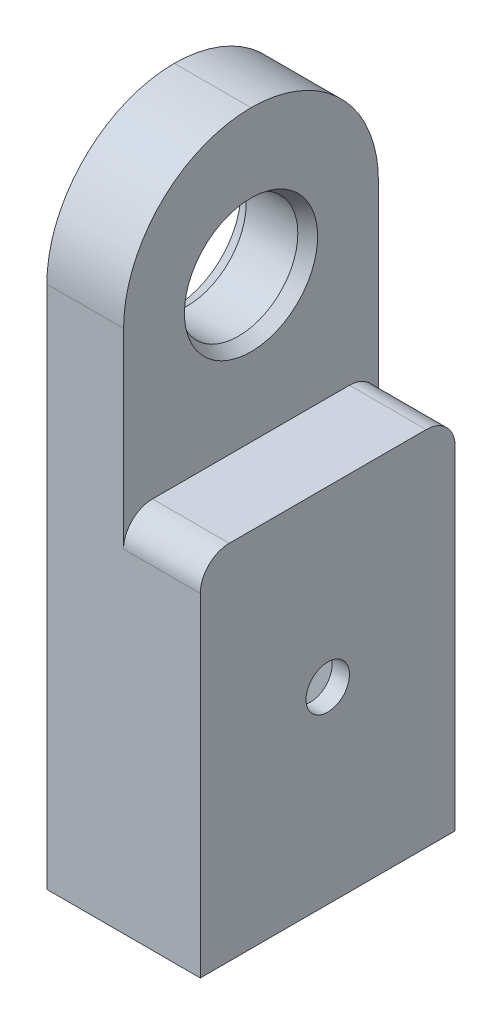
ISO-10303-21;
HEADER;
FILE_DESCRIPTION(('STEP AP214'),'2;1');
FILE_NAME('part.step','',(''),(''),'','','');
FILE_SCHEMA(('AUTOMOTIVE_DESIGN { 1 0 10303 214 1 1 1 1 }'));
ENDSEC;
DATA;
#1=APPLICATION_CONTEXT('core data for automotive mechanical design processes');
#2=APPLICATION_PROTOCOL_DEFINITION('international standard','automotive_design',2000,#1);
#3=PRODUCT_CONTEXT('',#1,'mechanical');
#4=PRODUCT('Part','Part','',(#3));
#5=PRODUCT_RELATED_PRODUCT_CATEGORY('part','',(#4));
#6=PRODUCT_DEFINITION_FORMATION('','',#4);
#7=PRODUCT_DEFINITION_CONTEXT('part definition',#1,'design');
#8=PRODUCT_DEFINITION('design','',#6,#7);
#9=PRODUCT_DEFINITION_SHAPE('','',#8);
#10=(LENGTH_UNIT() NAMED_UNIT(*) SI_UNIT(.MILLI.,.METRE.));
#11=(NAMED_UNIT(*) PLANE_ANGLE_UNIT() SI_UNIT($,.RADIAN.));
#12=(NAMED_UNIT(*) SI_UNIT($,.STERADIAN.) SOLID_ANGLE_UNIT());
#13=UNCERTAINTY_MEASURE_WITH_UNIT(LENGTH_MEASURE(1.E-05),#10,'distance_accuracy_value','');
#14=(GEOMETRIC_REPRESENTATION_CONTEXT(3) GLOBAL_UNCERTAINTY_ASSIGNED_CONTEXT((#13)) GLOBAL_UNIT_ASSIGNED_CONTEXT((#10,
#11,#12)) REPRESENTATION_CONTEXT('',''));
#15=CARTESIAN_POINT('',(0.,0.,0.));
#16=DIRECTION('',(0.,0.,1.));
#17=DIRECTION('',(1.,0.,0.));
#18=AXIS2_PLACEMENT_3D('',#15,#16,#17);
#19=CARTESIAN_POINT('',(0.,25.,0.));
#20=DIRECTION('',(0.,-1.,0.));
#21=DIRECTION('',(0.,0.,-1.));
#22=AXIS2_PLACEMENT_3D('',#19,#20,#21);
#23=PLANE('',#22);
#24=DIRECTION('',(0.,0.,-1.));
#25=VECTOR('',#24,1.);
#26=CARTESIAN_POINT('',(0.,25.,8.8));
#27=LINE('',#26,#25);
#28=CARTESIAN_POINT('',(0.,25.,6.8));
#29=VERTEX_POINT('',#28);
#30=CARTESIAN_POINT('',(0.,25.,-6.8));
#31=VERTEX_POINT('',#30);
#32=EDGE_CURVE('E217',#29,#31,#27,.T.);
#33=ORIENTED_EDGE('',*,*,#32,.F.);
#34=DIRECTION('',(1.,0.,0.));
#35=VECTOR('',#34,1.);
#36=CARTESIAN_POINT('',(0.,25.,6.8));
#37=LINE('',#36,#35);
#38=CARTESIAN_POINT('',(5.3,25.,6.8));
#39=VERTEX_POINT('',#38);
#40=EDGE_CURVE('E221',#29,#39,#37,.T.);
#41=ORIENTED_EDGE('',*,*,#40,.T.);
#42=DIRECTION('',(0.,0.,-1.));
#43=VECTOR('',#42,1.);
#44=CARTESIAN_POINT('',(5.3,25.,8.8));
#45=LINE('',#44,#43);
#46=CARTESIAN_POINT('',(5.3,25.,-6.8));
#47=VERTEX_POINT('',#46);
#48=EDGE_CURVE('E179',#39,#47,#45,.T.);
#49=ORIENTED_EDGE('',*,*,#48,.T.);
#50=DIRECTION('',(-1.,0.,0.));
#51=VECTOR('',#50,1.);
#52=CARTESIAN_POINT('',(0.,25.,-6.8));
#53=LINE('',#52,#51);
#54=EDGE_CURVE('E213',#47,#31,#53,.T.);
#55=ORIENTED_EDGE('',*,*,#54,.T.);
#56=EDGE_LOOP('',(#33,#41,#49,#55));
#57=FACE_BOUND('',#56,.T.);
#58=ADVANCED_FACE('F37',(#57),#23,.F.);
#59=CARTESIAN_POINT('',(5.3,25.,8.8));
#60=DIRECTION('',(-1.,0.,0.));
#61=DIRECTION('',(0.,0.,1.));
#62=AXIS2_PLACEMENT_3D('',#59,#60,#61);
#63=PLANE('',#62);
#64=CARTESIAN_POINT('',(5.3,13.,0.));
#65=DIRECTION('',(1.,0.,0.));
#66=DIRECTION('',(0.,0.,-1.));
#67=AXIS2_PLACEMENT_3D('',#64,#65,#66);
#68=CIRCLE('',#67,1.5);
#69=CARTESIAN_POINT('',(5.3,13.,-1.5));
#70=VERTEX_POINT('',#69);
#71=EDGE_CURVE('E350',#70,#70,#68,.T.);
#72=ORIENTED_EDGE('',*,*,#71,.F.);
#73=EDGE_LOOP('',(#72));
#74=FACE_BOUND('',#73,.T.);
#75=ORIENTED_EDGE('',*,*,#48,.F.);
#76=CARTESIAN_POINT('',(5.3,23.,6.8));
#77=DIRECTION('',(-1.,0.,0.));
#78=DIRECTION('',(0.,0.,1.));
#79=AXIS2_PLACEMENT_3D('',#76,#77,#78);
#80=CIRCLE('',#79,2.);
#81=CARTESIAN_POINT('',(5.3,23.,8.8));
#82=VERTEX_POINT('',#81);
#83=EDGE_CURVE('E226',#39,#82,#80,.F.);
#84=ORIENTED_EDGE('',*,*,#83,.T.);
#85=DIRECTION('',(0.,-1.,0.));
#86=VECTOR('',#85,1.);
#87=CARTESIAN_POINT('',(5.3,25.,8.8));
#88=LINE('',#87,#86);
#89=CARTESIAN_POINT('',(5.3,0.,8.8));
#90=VERTEX_POINT('',#89);
#91=EDGE_CURVE('E182',#82,#90,#88,.T.);
#92=ORIENTED_EDGE('',*,*,#91,.T.);
#93=DIRECTION('',(0.,0.,-1.));
#94=VECTOR('',#93,1.);
#95=CARTESIAN_POINT('',(5.3,0.,8.8));
#96=LINE('',#95,#94);
#97=CARTESIAN_POINT('',(5.3,0.,-8.8));
#98=VERTEX_POINT('',#97);
#99=EDGE_CURVE('E175',#90,#98,#96,.T.);
#100=ORIENTED_EDGE('',*,*,#99,.T.);
#101=DIRECTION('',(0.,-1.,0.));
#102=VECTOR('',#101,1.);
#103=CARTESIAN_POINT('',(5.3,25.,-8.8));
#104=LINE('',#103,#102);
#105=CARTESIAN_POINT('',(5.3,23.,-8.8));
#106=VERTEX_POINT('',#105);
#107=EDGE_CURVE('E199',#106,#98,#104,.T.);
#108=ORIENTED_EDGE('',*,*,#107,.F.);
#109=CARTESIAN_POINT('',(5.3,23.,-6.8));
#110=DIRECTION('',(-1.,0.,0.));
#111=DIRECTION('',(0.,0.,1.));
#112=AXIS2_PLACEMENT_3D('',#109,#110,#111);
#113=CIRCLE('',#112,2.);
#114=EDGE_CURVE('E224',#106,#47,#113,.F.);
#115=ORIENTED_EDGE('',*,*,#114,.T.);
#116=EDGE_LOOP('',(#75,#84,#92,#100,#108,#115));
#117=FACE_BOUND('',#116,.T.);
#118=ADVANCED_FACE('F271',(#74,#117),#63,.F.);
#119=CARTESIAN_POINT('',(-5.3,25.,-8.8));
#120=DIRECTION('',(0.,0.,1.));
#121=DIRECTION('',(1.,0.,0.));
#122=AXIS2_PLACEMENT_3D('',#119,#120,#121);
#123=PLANE('',#122);
#124=DIRECTION('',(0.,-1.,0.));
#125=VECTOR('',#124,1.);
#126=CARTESIAN_POINT('',(0.,45.,-8.8));
#127=LINE('',#126,#125);
#128=CARTESIAN_POINT('',(0.,36.2,-8.8));
#129=VERTEX_POINT('',#128);
#130=CARTESIAN_POINT('',(0.,23.,-8.8));
#131=VERTEX_POINT('',#130);
#132=EDGE_CURVE('E53',#129,#131,#127,.T.);
#133=ORIENTED_EDGE('',*,*,#132,.T.);
#134=DIRECTION('',(-1.,0.,0.));
#135=VECTOR('',#134,1.);
#136=CARTESIAN_POINT('',(-5.3,23.,-8.8));
#137=LINE('',#136,#135);
#138=EDGE_CURVE('E230',#131,#106,#137,.F.);
#139=ORIENTED_EDGE('',*,*,#138,.T.);
#140=ORIENTED_EDGE('',*,*,#107,.T.);
#141=DIRECTION('',(-1.,0.,0.));
#142=VECTOR('',#141,1.);
#143=CARTESIAN_POINT('',(-5.3,0.,-8.8));
#144=LINE('',#143,#142);
#145=CARTESIAN_POINT('',(-5.3,0.,-8.8));
#146=VERTEX_POINT('',#145);
#147=EDGE_CURVE('E186',#98,#146,#144,.T.);
#148=ORIENTED_EDGE('',*,*,#147,.T.);
#149=DIRECTION('',(0.,-1.,0.));
#150=VECTOR('',#149,1.);
#151=CARTESIAN_POINT('',(-5.3,25.,-8.8));
#152=LINE('',#151,#150);
#153=CARTESIAN_POINT('',(-5.3,36.2,-8.8));
#154=VERTEX_POINT('',#153);
#155=EDGE_CURVE('E197',#154,#146,#152,.T.);
#156=ORIENTED_EDGE('',*,*,#155,.F.);
#157=DIRECTION('',(-1.,0.,0.));
#158=VECTOR('',#157,1.);
#159=CARTESIAN_POINT('',(-5.3,36.2,-8.8));
#160=LINE('',#159,#158);
#161=EDGE_CURVE('E205',#154,#129,#160,.F.);
#162=ORIENTED_EDGE('',*,*,#161,.T.);
#163=EDGE_LOOP('',(#133,#139,#140,#148,#156,#162));
#164=FACE_BOUND('',#163,.T.);
#165=ADVANCED_FACE('F277',(#164),#123,.F.);
#166=CARTESIAN_POINT('',(-5.3,25.,8.8));
#167=DIRECTION('',(1.,0.,0.));
#168=DIRECTION('',(0.,0.,-1.));
#169=AXIS2_PLACEMENT_3D('',#166,#167,#168);
#170=PLANE('',#169);
#171=CARTESIAN_POINT('',(-5.3,35.,0.));
#172=DIRECTION('',(1.,0.,0.));
#173=DIRECTION('',(0.,0.,-1.));
#174=AXIS2_PLACEMENT_3D('',#171,#172,#173);
#175=CIRCLE('',#174,4.6);
#176=CARTESIAN_POINT('',(-5.3,35.,-4.6));
#177=VERTEX_POINT('',#176);
#178=EDGE_CURVE('E46',#177,#177,#175,.T.);
#179=ORIENTED_EDGE('',*,*,#178,.T.);
#180=EDGE_LOOP('',(#179));
#181=FACE_BOUND('',#180,.T.);
#182=CARTESIAN_POINT('',(-5.3,13.,0.));
#183=DIRECTION('',(1.,0.,0.));
#184=DIRECTION('',(0.,0.,-1.));
#185=AXIS2_PLACEMENT_3D('',#182,#183,#184);
#186=CIRCLE('',#185,1.5);
#187=CARTESIAN_POINT('',(-5.3,13.,-1.5));
#188=VERTEX_POINT('',#187);
#189=EDGE_CURVE('E240',#188,#188,#186,.T.);
#190=ORIENTED_EDGE('',*,*,#189,.T.);
#191=EDGE_LOOP('',(#190));
#192=FACE_BOUND('',#191,.T.);
#193=CARTESIAN_POINT('',(-5.3,36.2,0.));
#194=DIRECTION('',(1.,0.,0.));
#195=DIRECTION('',(0.,0.,-1.));
#196=AXIS2_PLACEMENT_3D('',#193,#194,#195);
#197=CIRCLE('',#196,8.8);
#198=CARTESIAN_POINT('',(-5.3,36.2,8.8));
#199=VERTEX_POINT('',#198);
#200=CARTESIAN_POINT('',(-5.3,45.,0.));
#201=VERTEX_POINT('',#200);
#202=EDGE_CURVE('E201',#199,#201,#197,.F.);
#203=ORIENTED_EDGE('',*,*,#202,.T.);
#204=CARTESIAN_POINT('',(-5.3,36.2,0.));
#205=DIRECTION('',(1.,0.,0.));
#206=DIRECTION('',(0.,0.,-1.));
#207=AXIS2_PLACEMENT_3D('',#204,#205,#206);
#208=CIRCLE('',#207,8.8);
#209=EDGE_CURVE('E203',#201,#154,#208,.F.);
#210=ORIENTED_EDGE('',*,*,#209,.T.);
#211=ORIENTED_EDGE('',*,*,#155,.T.);
#212=DIRECTION('',(0.,0.,1.));
#213=VECTOR('',#212,1.);
#214=CARTESIAN_POINT('',(-5.3,0.,8.8));
#215=LINE('',#214,#213);
#216=CARTESIAN_POINT('',(-5.3,0.,8.8));
#217=VERTEX_POINT('',#216);
#218=EDGE_CURVE('E189',#146,#217,#215,.T.);
#219=ORIENTED_EDGE('',*,*,#218,.T.);
#220=DIRECTION('',(0.,-1.,0.));
#221=VECTOR('',#220,1.);
#222=CARTESIAN_POINT('',(-5.3,25.,8.8));
#223=LINE('',#222,#221);
#224=EDGE_CURVE('E195',#199,#217,#223,.T.);
#225=ORIENTED_EDGE('',*,*,#224,.F.);
#226=EDGE_LOOP('',(#203,#210,#211,#219,#225));
#227=FACE_BOUND('',#226,.T.);
#228=ADVANCED_FACE('F248',(#181,#192,#227),#170,.F.);
#229=CARTESIAN_POINT('',(-5.3,25.,8.8));
#230=DIRECTION('',(0.,0.,-1.));
#231=DIRECTION('',(-1.,0.,0.));
#232=AXIS2_PLACEMENT_3D('',#229,#230,#231);
#233=PLANE('',#232);
#234=ORIENTED_EDGE('',*,*,#91,.F.);
#235=DIRECTION('',(1.,0.,0.));
#236=VECTOR('',#235,1.);
#237=CARTESIAN_POINT('',(-5.3,23.,8.8));
#238=LINE('',#237,#236);
#239=CARTESIAN_POINT('',(0.,23.,8.8));
#240=VERTEX_POINT('',#239);
#241=EDGE_CURVE('E228',#82,#240,#238,.F.);
#242=ORIENTED_EDGE('',*,*,#241,.T.);
#243=DIRECTION('',(0.,-1.,0.));
#244=VECTOR('',#243,1.);
#245=CARTESIAN_POINT('',(0.,45.,8.8));
#246=LINE('',#245,#244);
#247=CARTESIAN_POINT('',(0.,36.2,8.8));
#248=VERTEX_POINT('',#247);
#249=EDGE_CURVE('E61',#248,#240,#246,.T.);
#250=ORIENTED_EDGE('',*,*,#249,.F.);
#251=DIRECTION('',(1.,0.,0.));
#252=VECTOR('',#251,1.);
#253=CARTESIAN_POINT('',(-5.3,36.2,8.8));
#254=LINE('',#253,#252);
#255=EDGE_CURVE('E211',#248,#199,#254,.F.);
#256=ORIENTED_EDGE('',*,*,#255,.T.);
#257=ORIENTED_EDGE('',*,*,#224,.T.);
#258=DIRECTION('',(1.,0.,0.));
#259=VECTOR('',#258,1.);
#260=CARTESIAN_POINT('',(-5.3,0.,8.8));
#261=LINE('',#260,#259);
#262=EDGE_CURVE('E183',#217,#90,#261,.T.);
#263=ORIENTED_EDGE('',*,*,#262,.T.);
#264=EDGE_LOOP('',(#234,#242,#250,#256,#257,#263));
#265=FACE_BOUND('',#264,.T.);
#266=ADVANCED_FACE('F287',(#265),#233,.F.);
#267=CARTESIAN_POINT('',(0.,0.,0.));
#268=DIRECTION('',(0.,-1.,0.));
#269=DIRECTION('',(0.,0.,-1.));
#270=AXIS2_PLACEMENT_3D('',#267,#268,#269);
#271=PLANE('',#270);
#272=DIRECTION('',(0.,0.,1.));
#273=VECTOR('',#272,1.);
#274=CARTESIAN_POINT('',(4.1,0.,-7.6));
#275=LINE('',#274,#273);
#276=CARTESIAN_POINT('',(4.1,0.,-7.6));
#277=VERTEX_POINT('',#276);
#278=CARTESIAN_POINT('',(4.1,0.,7.6));
#279=VERTEX_POINT('',#278);
#280=EDGE_CURVE('E141',#277,#279,#275,.T.);
#281=ORIENTED_EDGE('',*,*,#280,.F.);
#282=DIRECTION('',(1.,0.,0.));
#283=VECTOR('',#282,1.);
#284=CARTESIAN_POINT('',(-4.1,0.,-7.6));
#285=LINE('',#284,#283);
#286=CARTESIAN_POINT('',(-4.1,0.,-7.6));
#287=VERTEX_POINT('',#286);
#288=EDGE_CURVE('E158',#287,#277,#285,.T.);
#289=ORIENTED_EDGE('',*,*,#288,.F.);
#290=DIRECTION('',(0.,0.,-1.));
#291=VECTOR('',#290,1.);
#292=CARTESIAN_POINT('',(-4.1,0.,-7.6));
#293=LINE('',#292,#291);
#294=CARTESIAN_POINT('',(-4.1,0.,7.6));
#295=VERTEX_POINT('',#294);
#296=EDGE_CURVE('E161',#295,#287,#293,.T.);
#297=ORIENTED_EDGE('',*,*,#296,.F.);
#298=DIRECTION('',(-1.,0.,0.));
#299=VECTOR('',#298,1.);
#300=CARTESIAN_POINT('',(-4.1,0.,7.6));
#301=LINE('',#300,#299);
#302=EDGE_CURVE('E169',#279,#295,#301,.T.);
#303=ORIENTED_EDGE('',*,*,#302,.F.);
#304=EDGE_LOOP('',(#281,#289,#297,#303));
#305=FACE_BOUND('',#304,.T.);
#306=ORIENTED_EDGE('',*,*,#99,.F.);
#307=ORIENTED_EDGE('',*,*,#262,.F.);
#308=ORIENTED_EDGE('',*,*,#218,.F.);
#309=ORIENTED_EDGE('',*,*,#147,.F.);
#310=EDGE_LOOP('',(#306,#307,#308,#309));
#311=FACE_BOUND('',#310,.T.);
#312=ADVANCED_FACE('F284',(#305,#311),#271,.T.);
#313=CARTESIAN_POINT('',(4.1,23.,-7.6));
#314=DIRECTION('',(1.,0.,0.));
#315=DIRECTION('',(0.,0.,-1.));
#316=AXIS2_PLACEMENT_3D('',#313,#314,#315);
#317=PLANE('',#316);
#318=CARTESIAN_POINT('',(4.1,13.,0.));
#319=DIRECTION('',(1.,0.,0.));
#320=DIRECTION('',(0.,0.,-1.));
#321=AXIS2_PLACEMENT_3D('',#318,#319,#320);
#322=CIRCLE('',#321,1.5);
#323=CARTESIAN_POINT('',(4.1,13.,-1.5));
#324=VERTEX_POINT('',#323);
#325=EDGE_CURVE('E218',#324,#324,#322,.T.);
#326=ORIENTED_EDGE('',*,*,#325,.T.);
#327=EDGE_LOOP('',(#326));
#328=FACE_BOUND('',#327,.T.);
#329=ORIENTED_EDGE('',*,*,#280,.T.);
#330=DIRECTION('',(0.,-1.,0.));
#331=VECTOR('',#330,1.);
#332=CARTESIAN_POINT('',(4.1,23.,7.6));
#333=LINE('',#332,#331);
#334=CARTESIAN_POINT('',(4.1,23.,7.6));
#335=VERTEX_POINT('',#334);
#336=EDGE_CURVE('E134',#335,#279,#333,.T.);
#337=ORIENTED_EDGE('',*,*,#336,.F.);
#338=DIRECTION('',(0.,0.,1.));
#339=VECTOR('',#338,1.);
#340=CARTESIAN_POINT('',(4.1,23.,-7.6));
#341=LINE('',#340,#339);
#342=CARTESIAN_POINT('',(4.1,23.,-7.6));
#343=VERTEX_POINT('',#342);
#344=EDGE_CURVE('E138',#343,#335,#341,.T.);
#345=ORIENTED_EDGE('',*,*,#344,.F.);
#346=DIRECTION('',(0.,-1.,0.));
#347=VECTOR('',#346,1.);
#348=CARTESIAN_POINT('',(4.1,23.,-7.6));
#349=LINE('',#348,#347);
#350=EDGE_CURVE('E173',#343,#277,#349,.T.);
#351=ORIENTED_EDGE('',*,*,#350,.T.);
#352=EDGE_LOOP('',(#329,#337,#345,#351));
#353=FACE_BOUND('',#352,.T.);
#354=ADVANCED_FACE('F136',(#328,#353),#317,.F.);
#355=CARTESIAN_POINT('',(-4.1,23.,-7.6));
#356=DIRECTION('',(0.,0.,-1.));
#357=DIRECTION('',(-1.,0.,0.));
#358=AXIS2_PLACEMENT_3D('',#355,#356,#357);
#359=PLANE('',#358);
#360=ORIENTED_EDGE('',*,*,#288,.T.);
#361=ORIENTED_EDGE('',*,*,#350,.F.);
#362=DIRECTION('',(1.,0.,0.));
#363=VECTOR('',#362,1.);
#364=CARTESIAN_POINT('',(-4.1,23.,-7.6));
#365=LINE('',#364,#363);
#366=CARTESIAN_POINT('',(-4.1,23.,-7.6));
#367=VERTEX_POINT('',#366);
#368=EDGE_CURVE('E146',#367,#343,#365,.T.);
#369=ORIENTED_EDGE('',*,*,#368,.F.);
#370=DIRECTION('',(0.,-1.,0.));
#371=VECTOR('',#370,1.);
#372=CARTESIAN_POINT('',(-4.1,23.,-7.6));
#373=LINE('',#372,#371);
#374=EDGE_CURVE('E176',#367,#287,#373,.T.);
#375=ORIENTED_EDGE('',*,*,#374,.T.);
#376=EDGE_LOOP('',(#360,#361,#369,#375));
#377=FACE_BOUND('',#376,.T.);
#378=ADVANCED_FACE('F361',(#377),#359,.F.);
#379=CARTESIAN_POINT('',(-4.1,23.,-7.6));
#380=DIRECTION('',(-1.,0.,0.));
#381=DIRECTION('',(0.,0.,1.));
#382=AXIS2_PLACEMENT_3D('',#379,#380,#381);
#383=PLANE('',#382);
#384=CARTESIAN_POINT('',(-4.1,13.,0.));
#385=DIRECTION('',(-1.,0.,0.));
#386=DIRECTION('',(0.,0.,1.));
#387=AXIS2_PLACEMENT_3D('',#384,#385,#386);
#388=CIRCLE('',#387,1.5);
#389=CARTESIAN_POINT('',(-4.1,13.,1.5));
#390=VERTEX_POINT('',#389);
#391=EDGE_CURVE('E237',#390,#390,#388,.T.);
#392=ORIENTED_EDGE('',*,*,#391,.T.);
#393=EDGE_LOOP('',(#392));
#394=FACE_BOUND('',#393,.T.);
#395=ORIENTED_EDGE('',*,*,#296,.T.);
#396=ORIENTED_EDGE('',*,*,#374,.F.);
#397=DIRECTION('',(0.,0.,-1.));
#398=VECTOR('',#397,1.);
#399=CARTESIAN_POINT('',(-4.1,23.,-7.6));
#400=LINE('',#399,#398);
#401=CARTESIAN_POINT('',(-4.1,23.,7.6));
#402=VERTEX_POINT('',#401);
#403=EDGE_CURVE('E154',#402,#367,#400,.T.);
#404=ORIENTED_EDGE('',*,*,#403,.F.);
#405=DIRECTION('',(0.,-1.,0.));
#406=VECTOR('',#405,1.);
#407=CARTESIAN_POINT('',(-4.1,23.,7.6));
#408=LINE('',#407,#406);
#409=EDGE_CURVE('E145',#402,#295,#408,.T.);
#410=ORIENTED_EDGE('',*,*,#409,.T.);
#411=EDGE_LOOP('',(#395,#396,#404,#410));
#412=FACE_BOUND('',#411,.T.);
#413=ADVANCED_FACE('F358',(#394,#412),#383,.F.);
#414=CARTESIAN_POINT('',(-4.1,23.,7.6));
#415=DIRECTION('',(0.,0.,1.));
#416=DIRECTION('',(1.,0.,0.));
#417=AXIS2_PLACEMENT_3D('',#414,#415,#416);
#418=PLANE('',#417);
#419=ORIENTED_EDGE('',*,*,#302,.T.);
#420=ORIENTED_EDGE('',*,*,#409,.F.);
#421=DIRECTION('',(-1.,0.,0.));
#422=VECTOR('',#421,1.);
#423=CARTESIAN_POINT('',(-4.1,23.,7.6));
#424=LINE('',#423,#422);
#425=EDGE_CURVE('E149',#335,#402,#424,.T.);
#426=ORIENTED_EDGE('',*,*,#425,.F.);
#427=ORIENTED_EDGE('',*,*,#336,.T.);
#428=EDGE_LOOP('',(#419,#420,#426,#427));
#429=FACE_BOUND('',#428,.T.);
#430=ADVANCED_FACE('F150',(#429),#418,.F.);
#431=CARTESIAN_POINT('',(0.,23.,0.));
#432=DIRECTION('',(0.,1.,0.));
#433=DIRECTION('',(0.,0.,1.));
#434=AXIS2_PLACEMENT_3D('',#431,#432,#433);
#435=PLANE('',#434);
#436=ORIENTED_EDGE('',*,*,#344,.T.);
#437=ORIENTED_EDGE('',*,*,#425,.T.);
#438=ORIENTED_EDGE('',*,*,#403,.T.);
#439=ORIENTED_EDGE('',*,*,#368,.T.);
#440=EDGE_LOOP('',(#436,#437,#438,#439));
#441=FACE_BOUND('',#440,.T.);
#442=ADVANCED_FACE('F156',(#441),#435,.F.);
#443=CARTESIAN_POINT('',(0.,45.,8.8));
#444=DIRECTION('',(-1.,0.,0.));
#445=DIRECTION('',(0.,0.,1.));
#446=AXIS2_PLACEMENT_3D('',#443,#444,#445);
#447=PLANE('',#446);
#448=CARTESIAN_POINT('',(0.,35.,0.));
#449=DIRECTION('',(-1.,0.,0.));
#450=DIRECTION('',(0.,0.,1.));
#451=AXIS2_PLACEMENT_3D('',#448,#449,#450);
#452=CIRCLE('',#451,4.60000000000001);
#453=CARTESIAN_POINT('',(0.,35.,4.60000000000001));
#454=VERTEX_POINT('',#453);
#455=EDGE_CURVE('E11',#454,#454,#452,.T.);
#456=ORIENTED_EDGE('',*,*,#455,.T.);
#457=EDGE_LOOP('',(#456));
#458=FACE_BOUND('',#457,.T.);
#459=ORIENTED_EDGE('',*,*,#132,.F.);
#460=CARTESIAN_POINT('',(0.,36.2,0.));
#461=DIRECTION('',(-1.,0.,0.));
#462=DIRECTION('',(0.,0.,1.));
#463=AXIS2_PLACEMENT_3D('',#460,#461,#462);
#464=CIRCLE('',#463,8.8);
#465=CARTESIAN_POINT('',(0.,45.,0.));
#466=VERTEX_POINT('',#465);
#467=EDGE_CURVE('E209',#129,#466,#464,.F.);
#468=ORIENTED_EDGE('',*,*,#467,.T.);
#469=CARTESIAN_POINT('',(0.,36.2,0.));
#470=DIRECTION('',(-1.,0.,0.));
#471=DIRECTION('',(0.,0.,1.));
#472=AXIS2_PLACEMENT_3D('',#469,#470,#471);
#473=CIRCLE('',#472,8.8);
#474=EDGE_CURVE('E207',#466,#248,#473,.F.);
#475=ORIENTED_EDGE('',*,*,#474,.T.);
#476=ORIENTED_EDGE('',*,*,#249,.T.);
#477=CARTESIAN_POINT('',(0.,23.,6.8));
#478=DIRECTION('',(-1.,0.,0.));
#479=DIRECTION('',(0.,0.,1.));
#480=AXIS2_PLACEMENT_3D('',#477,#478,#479);
#481=CIRCLE('',#480,2.);
#482=EDGE_CURVE('E232',#240,#29,#481,.T.);
#483=ORIENTED_EDGE('',*,*,#482,.T.);
#484=ORIENTED_EDGE('',*,*,#32,.T.);
#485=CARTESIAN_POINT('',(0.,23.,-6.8));
#486=DIRECTION('',(-1.,0.,0.));
#487=DIRECTION('',(0.,0.,1.));
#488=AXIS2_PLACEMENT_3D('',#485,#486,#487);
#489=CIRCLE('',#488,2.);
#490=EDGE_CURVE('E234',#31,#131,#489,.T.);
#491=ORIENTED_EDGE('',*,*,#490,.T.);
#492=EDGE_LOOP('',(#459,#468,#475,#476,#483,#484,#491));
#493=FACE_BOUND('',#492,.T.);
#494=ADVANCED_FACE('F261',(#458,#493),#447,.F.);
#495=CARTESIAN_POINT('',(-5.301,35.,0.));
#496=DIRECTION('',(1.,0.,0.));
#497=DIRECTION('',(0.,0.,-1.));
#498=AXIS2_PLACEMENT_3D('',#495,#496,#497);
#499=CYLINDRICAL_SURFACE('',#498,4.1);
#500=CARTESIAN_POINT('',(-4.43397459621556,35.,0.));
#501=DIRECTION('',(1.,0.,0.));
#502=DIRECTION('',(0.,0.,-1.));
#503=AXIS2_PLACEMENT_3D('',#500,#501,#502);
#504=CIRCLE('',#503,4.1);
#505=CARTESIAN_POINT('',(-4.43397459621556,35.,-4.1));
#506=VERTEX_POINT('',#505);
#507=EDGE_CURVE('E243',#506,#506,#504,.F.);
#508=ORIENTED_EDGE('',*,*,#507,.T.);
#509=EDGE_LOOP('',(#508));
#510=FACE_BOUND('',#509,.T.);
#511=CARTESIAN_POINT('',(-0.866025403784448,35.,0.));
#512=DIRECTION('',(-1.,0.,0.));
#513=DIRECTION('',(0.,0.,1.));
#514=AXIS2_PLACEMENT_3D('',#511,#512,#513);
#515=CIRCLE('',#514,4.1);
#516=CARTESIAN_POINT('',(-0.866025403784448,35.,4.1));
#517=VERTEX_POINT('',#516);
#518=EDGE_CURVE('E236',#517,#517,#515,.F.);
#519=ORIENTED_EDGE('',*,*,#518,.T.);
#520=EDGE_LOOP('',(#519));
#521=FACE_BOUND('',#520,.T.);
#522=ADVANCED_FACE('F257',(#510,#521),#499,.F.);
#523=CARTESIAN_POINT('',(0.,36.2,0.));
#524=DIRECTION('',(1.,0.,0.));
#525=DIRECTION('',(0.,0.,-1.));
#526=AXIS2_PLACEMENT_3D('',#523,#524,#525);
#527=CYLINDRICAL_SURFACE('',#526,8.8);
#528=ORIENTED_EDGE('',*,*,#255,.F.);
#529=ORIENTED_EDGE('',*,*,#474,.F.);
#530=DIRECTION('',(1.,0.,0.));
#531=VECTOR('',#530,1.);
#532=CARTESIAN_POINT('',(0.,45.,0.));
#533=LINE('',#532,#531);
#534=EDGE_CURVE('E214',#201,#466,#533,.T.);
#535=ORIENTED_EDGE('',*,*,#534,.F.);
#536=ORIENTED_EDGE('',*,*,#202,.F.);
#537=EDGE_LOOP('',(#528,#529,#535,#536));
#538=FACE_BOUND('',#537,.T.);
#539=ADVANCED_FACE('F260',(#538),#527,.T.);
#540=CARTESIAN_POINT('',(0.,36.2,0.));
#541=DIRECTION('',(-1.,0.,0.));
#542=DIRECTION('',(0.,0.,1.));
#543=AXIS2_PLACEMENT_3D('',#540,#541,#542);
#544=CYLINDRICAL_SURFACE('',#543,8.8);
#545=ORIENTED_EDGE('',*,*,#467,.F.);
#546=ORIENTED_EDGE('',*,*,#161,.F.);
#547=ORIENTED_EDGE('',*,*,#209,.F.);
#548=ORIENTED_EDGE('',*,*,#534,.T.);
#549=EDGE_LOOP('',(#545,#546,#547,#548));
#550=FACE_BOUND('',#549,.T.);
#551=ADVANCED_FACE('F296',(#550),#544,.T.);
#552=CARTESIAN_POINT('',(0.,23.,6.8));
#553=DIRECTION('',(1.,0.,0.));
#554=DIRECTION('',(0.,0.,-1.));
#555=AXIS2_PLACEMENT_3D('',#552,#553,#554);
#556=CYLINDRICAL_SURFACE('',#555,2.);
#557=ORIENTED_EDGE('',*,*,#482,.F.);
#558=ORIENTED_EDGE('',*,*,#241,.F.);
#559=ORIENTED_EDGE('',*,*,#83,.F.);
#560=ORIENTED_EDGE('',*,*,#40,.F.);
#561=EDGE_LOOP('',(#557,#558,#559,#560));
#562=FACE_BOUND('',#561,.T.);
#563=ADVANCED_FACE('F299',(#562),#556,.T.);
#564=CARTESIAN_POINT('',(0.,23.,-6.8));
#565=DIRECTION('',(-1.,0.,0.));
#566=DIRECTION('',(0.,0.,1.));
#567=AXIS2_PLACEMENT_3D('',#564,#565,#566);
#568=CYLINDRICAL_SURFACE('',#567,2.);
#569=ORIENTED_EDGE('',*,*,#114,.F.);
#570=ORIENTED_EDGE('',*,*,#138,.F.);
#571=ORIENTED_EDGE('',*,*,#490,.F.);
#572=ORIENTED_EDGE('',*,*,#54,.F.);
#573=EDGE_LOOP('',(#569,#570,#571,#572));
#574=FACE_BOUND('',#573,.T.);
#575=ADVANCED_FACE('F306',(#574),#568,.T.);
#576=CARTESIAN_POINT('',(-5.3,13.,0.));
#577=DIRECTION('',(1.,0.,0.));
#578=DIRECTION('',(0.,0.,-1.));
#579=AXIS2_PLACEMENT_3D('',#576,#577,#578);
#580=CYLINDRICAL_SURFACE('',#579,1.5);
#581=ORIENTED_EDGE('',*,*,#189,.F.);
#582=EDGE_LOOP('',(#581));
#583=FACE_BOUND('',#582,.T.);
#584=ORIENTED_EDGE('',*,*,#391,.F.);
#585=EDGE_LOOP('',(#584));
#586=FACE_BOUND('',#585,.T.);
#587=ADVANCED_FACE('F309',(#583,#586),#580,.F.);
#588=ORIENTED_EDGE('',*,*,#71,.T.);
#589=EDGE_LOOP('',(#588));
#590=FACE_BOUND('',#589,.T.);
#591=ORIENTED_EDGE('',*,*,#325,.F.);
#592=EDGE_LOOP('',(#591));
#593=FACE_BOUND('',#592,.T.);
#594=ADVANCED_FACE('F254',(#590,#593),#580,.F.);
#595=CARTESIAN_POINT('',(-4.43397459621556,35.,0.));
#596=DIRECTION('',(-1.,0.,0.));
#597=DIRECTION('',(0.,0.,1.));
#598=AXIS2_PLACEMENT_3D('',#595,#596,#597);
#599=CONICAL_SURFACE('',#598,4.1,0.523598775598301);
#600=ORIENTED_EDGE('',*,*,#178,.F.);
#601=EDGE_LOOP('',(#600));
#602=FACE_BOUND('',#601,.T.);
#603=ORIENTED_EDGE('',*,*,#507,.F.);
#604=EDGE_LOOP('',(#603));
#605=FACE_BOUND('',#604,.T.);
#606=ADVANCED_FACE('F251',(#602,#605),#599,.F.);
#607=CARTESIAN_POINT('',(-0.866025403784448,35.,0.));
#608=DIRECTION('',(1.,0.,0.));
#609=DIRECTION('',(0.,0.,-1.));
#610=AXIS2_PLACEMENT_3D('',#607,#608,#609);
#611=CONICAL_SURFACE('',#610,4.1,0.523598775598301);
#612=ORIENTED_EDGE('',*,*,#455,.F.);
#613=EDGE_LOOP('',(#612));
#614=FACE_BOUND('',#613,.T.);
#615=ORIENTED_EDGE('',*,*,#518,.F.);
#616=EDGE_LOOP('',(#615));
#617=FACE_BOUND('',#616,.T.);
#618=ADVANCED_FACE('F40',(#614,#617),#611,.F.);
#619=CLOSED_SHELL('',(#58,#118,#165,#228,#266,#312,#354,#378,#413,#430,#442,#494,#522,#539,#551,
#563,#575,#587,#594,#606,#618));
#620=MANIFOLD_SOLID_BREP('B2',#619);
#621=ADVANCED_BREP_SHAPE_REPRESENTATION('',(#18,#620),#14);
#622=SHAPE_DEFINITION_REPRESENTATION(#9,#621);
ENDSEC;
END-ISO-10303-21;
